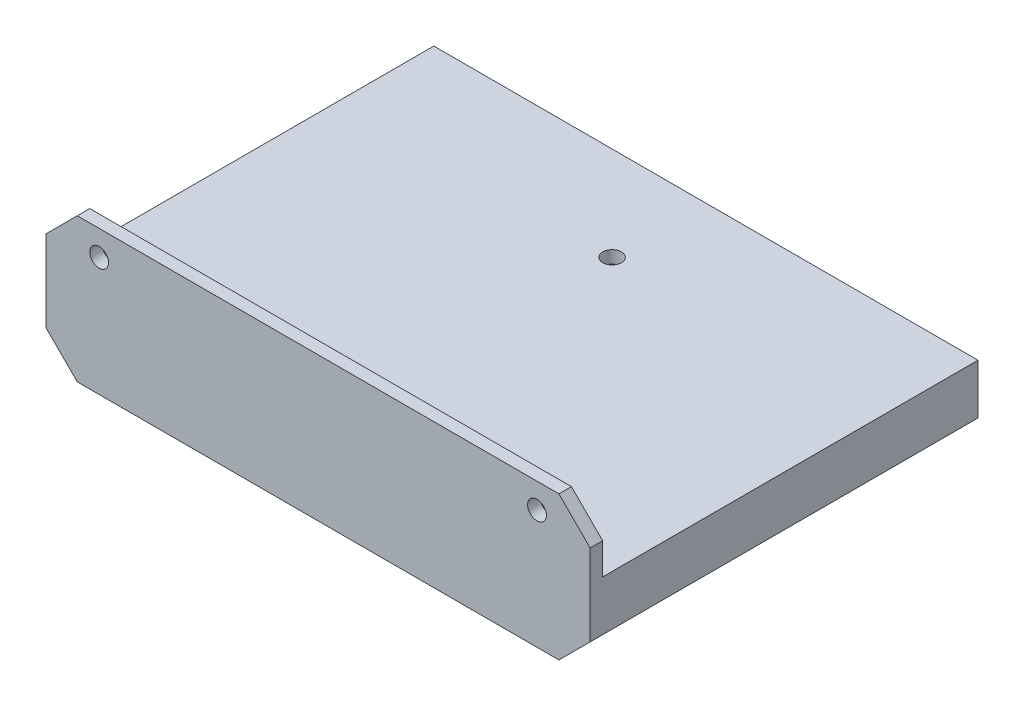
ISO-10303-21;
HEADER;
FILE_DESCRIPTION(('STEP AP214'),'2;1');
FILE_NAME('part.step','',(''),(''),'','','');
FILE_SCHEMA(('AUTOMOTIVE_DESIGN { 1 0 10303 214 1 1 1 1 }'));
ENDSEC;
DATA;
#1=APPLICATION_CONTEXT('core data for automotive mechanical design processes');
#2=APPLICATION_PROTOCOL_DEFINITION('international standard','automotive_design',2000,#1);
#3=PRODUCT_CONTEXT('',#1,'mechanical');
#4=PRODUCT('Part','Part','',(#3));
#5=PRODUCT_RELATED_PRODUCT_CATEGORY('part','',(#4));
#6=PRODUCT_DEFINITION_FORMATION('','',#4);
#7=PRODUCT_DEFINITION_CONTEXT('part definition',#1,'design');
#8=PRODUCT_DEFINITION('design','',#6,#7);
#9=PRODUCT_DEFINITION_SHAPE('','',#8);
#10=(LENGTH_UNIT() NAMED_UNIT(*) SI_UNIT(.MILLI.,.METRE.));
#11=(NAMED_UNIT(*) PLANE_ANGLE_UNIT() SI_UNIT($,.RADIAN.));
#12=(NAMED_UNIT(*) SI_UNIT($,.STERADIAN.) SOLID_ANGLE_UNIT());
#13=UNCERTAINTY_MEASURE_WITH_UNIT(LENGTH_MEASURE(1.E-05),#10,'distance_accuracy_value','');
#14=(GEOMETRIC_REPRESENTATION_CONTEXT(3) GLOBAL_UNCERTAINTY_ASSIGNED_CONTEXT((#13)) GLOBAL_UNIT_ASSIGNED_CONTEXT((#10,
#11,#12)) REPRESENTATION_CONTEXT('',''));
#15=CARTESIAN_POINT('',(0.,0.,0.));
#16=DIRECTION('',(0.,0.,1.));
#17=DIRECTION('',(1.,0.,0.));
#18=AXIS2_PLACEMENT_3D('',#15,#16,#17);
#19=CARTESIAN_POINT('',(0.,17.2426406871193,15.));
#20=DIRECTION('',(0.,-1.,0.));
#21=DIRECTION('',(1.,0.,0.));
#22=AXIS2_PLACEMENT_3D('',#19,#20,#21);
#23=CYLINDRICAL_SURFACE('',#22,1.5);
#24=CARTESIAN_POINT('',(0.,13.,15.));
#25=DIRECTION('',(0.,-1.,0.));
#26=DIRECTION('',(0.,0.,-1.));
#27=AXIS2_PLACEMENT_3D('',#24,#25,#26);
#28=CIRCLE('',#27,1.5);
#29=CARTESIAN_POINT('',(0.,13.,13.5));
#30=VERTEX_POINT('',#29);
#31=EDGE_CURVE('E216',#30,#30,#28,.F.);
#32=ORIENTED_EDGE('',*,*,#31,.T.);
#33=EDGE_LOOP('',(#32));
#34=FACE_BOUND('',#33,.T.);
#35=CARTESIAN_POINT('',(0.,11.,15.));
#36=DIRECTION('',(0.,-1.,0.));
#37=DIRECTION('',(1.,0.,0.));
#38=AXIS2_PLACEMENT_3D('',#35,#36,#37);
#39=CIRCLE('',#38,1.5);
#40=CARTESIAN_POINT('',(1.50000000000001,11.,15.));
#41=VERTEX_POINT('',#40);
#42=EDGE_CURVE('E213',#41,#41,#39,.F.);
#43=ORIENTED_EDGE('',*,*,#42,.F.);
#44=EDGE_LOOP('',(#43));
#45=FACE_BOUND('',#44,.T.);
#46=ADVANCED_FACE('F39',(#34,#45),#23,.F.);
#47=CARTESIAN_POINT('',(-43.5000000000001,13.,60.));
#48=DIRECTION('',(1.,0.,0.));
#49=DIRECTION('',(0.,0.,-1.));
#50=AXIS2_PLACEMENT_3D('',#47,#48,#49);
#51=PLANE('',#50);
#52=DIRECTION('',(0.,-1.,0.));
#53=VECTOR('',#52,1.);
#54=CARTESIAN_POINT('',(-43.5000000000001,13.,0.));
#55=LINE('',#54,#53);
#56=CARTESIAN_POINT('',(-43.5000000000001,13.,0.));
#57=VERTEX_POINT('',#56);
#58=CARTESIAN_POINT('',(-43.5000000000001,5.00000000000002,0.));
#59=VERTEX_POINT('',#58);
#60=EDGE_CURVE('E187',#57,#59,#55,.T.);
#61=ORIENTED_EDGE('',*,*,#60,.T.);
#62=DIRECTION('',(0.,0.,1.));
#63=VECTOR('',#62,1.);
#64=CARTESIAN_POINT('',(-43.5000000000001,5.00000000000002,60.));
#65=LINE('',#64,#63);
#66=CARTESIAN_POINT('',(-43.5000000000001,5.00000000000002,62.));
#67=VERTEX_POINT('',#66);
#68=EDGE_CURVE('E265',#59,#67,#65,.T.);
#69=ORIENTED_EDGE('',*,*,#68,.T.);
#70=DIRECTION('',(0.,-1.,0.));
#71=VECTOR('',#70,1.);
#72=CARTESIAN_POINT('',(-43.5000000000001,0.,62.));
#73=LINE('',#72,#71);
#74=CARTESIAN_POINT('',(-43.5000000000001,18.,62.));
#75=VERTEX_POINT('',#74);
#76=EDGE_CURVE('E275',#75,#67,#73,.T.);
#77=ORIENTED_EDGE('',*,*,#76,.F.);
#78=DIRECTION('',(0.,0.,-1.));
#79=VECTOR('',#78,1.);
#80=CARTESIAN_POINT('',(-43.5000000000001,18.,60.));
#81=LINE('',#80,#79);
#82=CARTESIAN_POINT('',(-43.5000000000001,18.,60.));
#83=VERTEX_POINT('',#82);
#84=EDGE_CURVE('E162',#75,#83,#81,.T.);
#85=ORIENTED_EDGE('',*,*,#84,.T.);
#86=DIRECTION('',(0.,-1.,0.));
#87=VECTOR('',#86,1.);
#88=CARTESIAN_POINT('',(-43.5000000000001,0.,60.));
#89=LINE('',#88,#87);
#90=CARTESIAN_POINT('',(-43.5000000000001,13.,60.));
#91=VERTEX_POINT('',#90);
#92=EDGE_CURVE('E154',#83,#91,#89,.T.);
#93=ORIENTED_EDGE('',*,*,#92,.T.);
#94=DIRECTION('',(0.,0.,-1.));
#95=VECTOR('',#94,1.);
#96=CARTESIAN_POINT('',(-43.5000000000001,13.,60.));
#97=LINE('',#96,#95);
#98=EDGE_CURVE('E158',#91,#57,#97,.T.);
#99=ORIENTED_EDGE('',*,*,#98,.T.);
#100=EDGE_LOOP('',(#61,#69,#77,#85,#93,#99));
#101=FACE_BOUND('',#100,.T.);
#102=ADVANCED_FACE('F157',(#101),#51,.F.);
#103=CARTESIAN_POINT('',(-38.5000000000001,7.99999999999999,60.));
#104=DIRECTION('',(-0.707106781186544,-0.707106781186552,0.));
#105=DIRECTION('',(0.707106781186552,-0.707106781186544,0.));
#106=AXIS2_PLACEMENT_3D('',#103,#104,#105);
#107=PLANE('',#106);
#108=DIRECTION('',(0.,0.,-1.));
#109=VECTOR('',#108,1.);
#110=CARTESIAN_POINT('',(-30.5,0.,60.));
#111=LINE('',#110,#109);
#112=CARTESIAN_POINT('',(-30.5,0.,60.));
#113=VERTEX_POINT('',#112);
#114=CARTESIAN_POINT('',(-30.5,0.,1.));
#115=VERTEX_POINT('',#114);
#116=EDGE_CURVE('E209',#113,#115,#111,.T.);
#117=ORIENTED_EDGE('',*,*,#116,.T.);
#118=DIRECTION('',(-0.707106781186552,0.707106781186544,0.));
#119=VECTOR('',#118,1.);
#120=CARTESIAN_POINT('',(-38.5000000000001,7.99999999999999,1.));
#121=LINE('',#120,#119);
#122=CARTESIAN_POINT('',(-38.5000000000001,7.99999999999999,1.));
#123=VERTEX_POINT('',#122);
#124=EDGE_CURVE('E233',#115,#123,#121,.T.);
#125=ORIENTED_EDGE('',*,*,#124,.T.);
#126=DIRECTION('',(0.,0.,-1.));
#127=VECTOR('',#126,1.);
#128=CARTESIAN_POINT('',(-38.5000000000001,7.99999999999999,60.));
#129=LINE('',#128,#127);
#130=CARTESIAN_POINT('',(-38.5000000000001,7.99999999999999,60.));
#131=VERTEX_POINT('',#130);
#132=EDGE_CURVE('E206',#131,#123,#129,.T.);
#133=ORIENTED_EDGE('',*,*,#132,.F.);
#134=DIRECTION('',(-0.707106781186552,0.707106781186544,0.));
#135=VECTOR('',#134,1.);
#136=CARTESIAN_POINT('',(-38.5000000000001,7.99999999999999,60.));
#137=LINE('',#136,#135);
#138=EDGE_CURVE('E197',#113,#131,#137,.T.);
#139=ORIENTED_EDGE('',*,*,#138,.F.);
#140=EDGE_LOOP('',(#117,#125,#133,#139));
#141=FACE_BOUND('',#140,.T.);
#142=ADVANCED_FACE('F339',(#141),#107,.F.);
#143=CARTESIAN_POINT('',(38.5000000000001,7.99999999999999,60.));
#144=DIRECTION('',(0.,1.,0.));
#145=DIRECTION('',(-1.,0.,0.));
#146=AXIS2_PLACEMENT_3D('',#143,#144,#145);
#147=PLANE('',#146);
#148=CARTESIAN_POINT('',(0.,7.99999999999999,15.));
#149=DIRECTION('',(0.,-1.,0.));
#150=DIRECTION('',(1.,0.,0.));
#151=AXIS2_PLACEMENT_3D('',#148,#149,#150);
#152=CIRCLE('',#151,4.);
#153=CARTESIAN_POINT('',(4.00000000000001,7.99999999999999,15.));
#154=VERTEX_POINT('',#153);
#155=EDGE_CURVE('E242',#154,#154,#152,.T.);
#156=ORIENTED_EDGE('',*,*,#155,.F.);
#157=EDGE_LOOP('',(#156));
#158=FACE_BOUND('',#157,.T.);
#159=ORIENTED_EDGE('',*,*,#132,.T.);
#160=DIRECTION('',(1.,0.,0.));
#161=VECTOR('',#160,1.);
#162=CARTESIAN_POINT('',(38.5000000000001,7.99999999999999,1.));
#163=LINE('',#162,#161);
#164=CARTESIAN_POINT('',(38.5000000000001,7.99999999999999,1.));
#165=VERTEX_POINT('',#164);
#166=EDGE_CURVE('E231',#123,#165,#163,.T.);
#167=ORIENTED_EDGE('',*,*,#166,.T.);
#168=DIRECTION('',(0.,0.,-1.));
#169=VECTOR('',#168,1.);
#170=CARTESIAN_POINT('',(38.5000000000001,7.99999999999999,60.));
#171=LINE('',#170,#169);
#172=CARTESIAN_POINT('',(38.5000000000001,7.99999999999999,60.));
#173=VERTEX_POINT('',#172);
#174=EDGE_CURVE('E203',#173,#165,#171,.T.);
#175=ORIENTED_EDGE('',*,*,#174,.F.);
#176=DIRECTION('',(1.,0.,0.));
#177=VECTOR('',#176,1.);
#178=CARTESIAN_POINT('',(38.5000000000001,7.99999999999999,60.));
#179=LINE('',#178,#177);
#180=EDGE_CURVE('E183',#131,#173,#179,.T.);
#181=ORIENTED_EDGE('',*,*,#180,.F.);
#182=EDGE_LOOP('',(#159,#167,#175,#181));
#183=FACE_BOUND('',#182,.T.);
#184=ADVANCED_FACE('F293',(#158,#183),#147,.F.);
#185=CARTESIAN_POINT('',(30.5,0.,60.));
#186=DIRECTION('',(0.707106781186544,-0.707106781186551,0.));
#187=DIRECTION('',(0.707106781186551,0.707106781186544,0.));
#188=AXIS2_PLACEMENT_3D('',#185,#186,#187);
#189=PLANE('',#188);
#190=ORIENTED_EDGE('',*,*,#174,.T.);
#191=DIRECTION('',(-0.707106781186551,-0.707106781186544,0.));
#192=VECTOR('',#191,1.);
#193=CARTESIAN_POINT('',(30.5,0.,1.));
#194=LINE('',#193,#192);
#195=CARTESIAN_POINT('',(30.5,0.,1.));
#196=VERTEX_POINT('',#195);
#197=EDGE_CURVE('E212',#165,#196,#194,.T.);
#198=ORIENTED_EDGE('',*,*,#197,.T.);
#199=DIRECTION('',(0.,0.,-1.));
#200=VECTOR('',#199,1.);
#201=CARTESIAN_POINT('',(30.5,0.,60.));
#202=LINE('',#201,#200);
#203=CARTESIAN_POINT('',(30.5,0.,60.));
#204=VERTEX_POINT('',#203);
#205=EDGE_CURVE('E200',#204,#196,#202,.T.);
#206=ORIENTED_EDGE('',*,*,#205,.F.);
#207=DIRECTION('',(-0.707106781186551,-0.707106781186544,0.));
#208=VECTOR('',#207,1.);
#209=CARTESIAN_POINT('',(30.5,0.,60.));
#210=LINE('',#209,#208);
#211=EDGE_CURVE('E180',#173,#204,#210,.T.);
#212=ORIENTED_EDGE('',*,*,#211,.F.);
#213=EDGE_LOOP('',(#190,#198,#206,#212));
#214=FACE_BOUND('',#213,.T.);
#215=ADVANCED_FACE('F298',(#214),#189,.F.);
#216=CARTESIAN_POINT('',(30.5,0.,60.));
#217=DIRECTION('',(0.,1.,0.));
#218=DIRECTION('',(-1.,0.,0.));
#219=AXIS2_PLACEMENT_3D('',#216,#217,#218);
#220=PLANE('',#219);
#221=DIRECTION('',(1.,0.,0.));
#222=VECTOR('',#221,1.);
#223=CARTESIAN_POINT('',(30.5,0.,0.));
#224=LINE('',#223,#222);
#225=CARTESIAN_POINT('',(31.9142135623731,0.,0.));
#226=VERTEX_POINT('',#225);
#227=CARTESIAN_POINT('',(38.5000000000001,0.,0.));
#228=VERTEX_POINT('',#227);
#229=EDGE_CURVE('E192',#226,#228,#224,.T.);
#230=ORIENTED_EDGE('',*,*,#229,.T.);
#231=DIRECTION('',(0.,0.,1.));
#232=VECTOR('',#231,1.);
#233=CARTESIAN_POINT('',(38.5000000000001,0.,60.));
#234=LINE('',#233,#232);
#235=CARTESIAN_POINT('',(38.5,0.,62.));
#236=VERTEX_POINT('',#235);
#237=EDGE_CURVE('E254',#228,#236,#234,.T.);
#238=ORIENTED_EDGE('',*,*,#237,.T.);
#239=DIRECTION('',(1.,0.,0.));
#240=VECTOR('',#239,1.);
#241=CARTESIAN_POINT('',(-43.5000000000001,0.,62.));
#242=LINE('',#241,#240);
#243=CARTESIAN_POINT('',(-38.5000000000001,0.,62.));
#244=VERTEX_POINT('',#243);
#245=EDGE_CURVE('E278',#244,#236,#242,.T.);
#246=ORIENTED_EDGE('',*,*,#245,.F.);
#247=DIRECTION('',(0.,0.,-1.));
#248=VECTOR('',#247,1.);
#249=CARTESIAN_POINT('',(-38.5000000000001,0.,60.));
#250=LINE('',#249,#248);
#251=CARTESIAN_POINT('',(-38.5000000000001,0.,0.));
#252=VERTEX_POINT('',#251);
#253=EDGE_CURVE('E251',#244,#252,#250,.T.);
#254=ORIENTED_EDGE('',*,*,#253,.T.);
#255=DIRECTION('',(1.,0.,0.));
#256=VECTOR('',#255,1.);
#257=CARTESIAN_POINT('',(-43.5000000000001,0.,0.));
#258=LINE('',#257,#256);
#259=CARTESIAN_POINT('',(-31.9142135623731,0.,0.));
#260=VERTEX_POINT('',#259);
#261=EDGE_CURVE('E189',#252,#260,#258,.T.);
#262=ORIENTED_EDGE('',*,*,#261,.T.);
#263=DIRECTION('',(-0.816496580927728,0.,-0.577350269189624));
#264=VECTOR('',#263,1.);
#265=CARTESIAN_POINT('',(-35.8333333333334,0.,-2.77123616632828));
#266=LINE('',#265,#264);
#267=EDGE_CURVE('E220',#260,#115,#266,.F.);
#268=ORIENTED_EDGE('',*,*,#267,.T.);
#269=ORIENTED_EDGE('',*,*,#116,.F.);
#270=DIRECTION('',(1.,0.,0.));
#271=VECTOR('',#270,1.);
#272=CARTESIAN_POINT('',(-43.5000000000001,0.,60.));
#273=LINE('',#272,#271);
#274=EDGE_CURVE('E164',#113,#204,#273,.T.);
#275=ORIENTED_EDGE('',*,*,#274,.T.);
#276=ORIENTED_EDGE('',*,*,#205,.T.);
#277=DIRECTION('',(-0.816496580927727,0.,0.577350269189624));
#278=VECTOR('',#277,1.);
#279=CARTESIAN_POINT('',(30.5,0.,1.));
#280=LINE('',#279,#278);
#281=EDGE_CURVE('E222',#196,#226,#280,.F.);
#282=ORIENTED_EDGE('',*,*,#281,.T.);
#283=EDGE_LOOP('',(#230,#238,#246,#254,#262,#268,#269,#275,#276,#282));
#284=FACE_BOUND('',#283,.T.);
#285=ADVANCED_FACE('F301',(#284),#220,.F.);
#286=CARTESIAN_POINT('',(43.5000000000001,13.,60.));
#287=DIRECTION('',(-1.,0.,0.));
#288=DIRECTION('',(0.,-1.,0.));
#289=AXIS2_PLACEMENT_3D('',#286,#287,#288);
#290=PLANE('',#289);
#291=DIRECTION('',(0.,1.,0.));
#292=VECTOR('',#291,1.);
#293=CARTESIAN_POINT('',(43.5000000000001,0.,62.));
#294=LINE('',#293,#292);
#295=CARTESIAN_POINT('',(43.5000000000001,4.99999999999999,62.));
#296=VERTEX_POINT('',#295);
#297=CARTESIAN_POINT('',(43.5000000000001,18.,62.));
#298=VERTEX_POINT('',#297);
#299=EDGE_CURVE('E305',#296,#298,#294,.T.);
#300=ORIENTED_EDGE('',*,*,#299,.F.);
#301=DIRECTION('',(0.,0.,-1.));
#302=VECTOR('',#301,1.);
#303=CARTESIAN_POINT('',(43.5000000000001,4.99999999999999,60.));
#304=LINE('',#303,#302);
#305=CARTESIAN_POINT('',(43.5000000000001,4.99999999999999,0.));
#306=VERTEX_POINT('',#305);
#307=EDGE_CURVE('E244',#296,#306,#304,.T.);
#308=ORIENTED_EDGE('',*,*,#307,.T.);
#309=DIRECTION('',(0.,1.,0.));
#310=VECTOR('',#309,1.);
#311=CARTESIAN_POINT('',(43.5000000000001,13.,0.));
#312=LINE('',#311,#310);
#313=CARTESIAN_POINT('',(43.5000000000001,13.,0.));
#314=VERTEX_POINT('',#313);
#315=EDGE_CURVE('E195',#306,#314,#312,.T.);
#316=ORIENTED_EDGE('',*,*,#315,.T.);
#317=DIRECTION('',(0.,0.,-1.));
#318=VECTOR('',#317,1.);
#319=CARTESIAN_POINT('',(43.5000000000001,13.,60.));
#320=LINE('',#319,#318);
#321=CARTESIAN_POINT('',(43.5000000000001,13.,60.));
#322=VERTEX_POINT('',#321);
#323=EDGE_CURVE('E175',#322,#314,#320,.T.);
#324=ORIENTED_EDGE('',*,*,#323,.F.);
#325=DIRECTION('',(0.,1.,0.));
#326=VECTOR('',#325,1.);
#327=CARTESIAN_POINT('',(43.5000000000001,0.,60.));
#328=LINE('',#327,#326);
#329=CARTESIAN_POINT('',(43.5000000000001,18.,60.));
#330=VERTEX_POINT('',#329);
#331=EDGE_CURVE('E179',#322,#330,#328,.T.);
#332=ORIENTED_EDGE('',*,*,#331,.T.);
#333=DIRECTION('',(0.,0.,1.));
#334=VECTOR('',#333,1.);
#335=CARTESIAN_POINT('',(43.5000000000001,18.,60.));
#336=LINE('',#335,#334);
#337=EDGE_CURVE('E235',#330,#298,#336,.T.);
#338=ORIENTED_EDGE('',*,*,#337,.T.);
#339=EDGE_LOOP('',(#300,#308,#316,#324,#332,#338));
#340=FACE_BOUND('',#339,.T.);
#341=ADVANCED_FACE('F381',(#340),#290,.F.);
#342=CARTESIAN_POINT('',(-43.5000000000001,13.,60.));
#343=DIRECTION('',(0.,-1.,0.));
#344=DIRECTION('',(0.,0.,-1.));
#345=AXIS2_PLACEMENT_3D('',#342,#343,#344);
#346=PLANE('',#345);
#347=ORIENTED_EDGE('',*,*,#31,.F.);
#348=EDGE_LOOP('',(#347));
#349=FACE_BOUND('',#348,.T.);
#350=DIRECTION('',(-1.,0.,0.));
#351=VECTOR('',#350,1.);
#352=CARTESIAN_POINT('',(-43.5000000000001,13.,0.));
#353=LINE('',#352,#351);
#354=EDGE_CURVE('E174',#314,#57,#353,.T.);
#355=ORIENTED_EDGE('',*,*,#354,.T.);
#356=ORIENTED_EDGE('',*,*,#98,.F.);
#357=DIRECTION('',(-1.,0.,0.));
#358=VECTOR('',#357,1.);
#359=CARTESIAN_POINT('',(-43.5000000000001,13.,60.));
#360=LINE('',#359,#358);
#361=EDGE_CURVE('E171',#322,#91,#360,.T.);
#362=ORIENTED_EDGE('',*,*,#361,.F.);
#363=ORIENTED_EDGE('',*,*,#323,.T.);
#364=EDGE_LOOP('',(#355,#356,#362,#363));
#365=FACE_BOUND('',#364,.T.);
#366=ADVANCED_FACE('F169',(#349,#365),#346,.F.);
#367=CARTESIAN_POINT('',(0.,0.,0.));
#368=DIRECTION('',(0.,0.,1.));
#369=DIRECTION('',(1.,0.,0.));
#370=AXIS2_PLACEMENT_3D('',#367,#368,#369);
#371=PLANE('',#370);
#372=ORIENTED_EDGE('',*,*,#315,.F.);
#373=DIRECTION('',(0.70710678118655,0.707106781186546,0.));
#374=VECTOR('',#373,1.);
#375=CARTESIAN_POINT('',(43.5000000000001,4.99999999999999,0.));
#376=LINE('',#375,#374);
#377=EDGE_CURVE('E249',#306,#228,#376,.F.);
#378=ORIENTED_EDGE('',*,*,#377,.T.);
#379=ORIENTED_EDGE('',*,*,#229,.F.);
#380=DIRECTION('',(0.707106781186551,0.707106781186544,0.));
#381=VECTOR('',#380,1.);
#382=CARTESIAN_POINT('',(15.9571067811864,-15.9571067811866,0.));
#383=LINE('',#382,#381);
#384=CARTESIAN_POINT('',(40.9142135623732,9.,0.));
#385=VERTEX_POINT('',#384);
#386=EDGE_CURVE('E229',#226,#385,#383,.T.);
#387=ORIENTED_EDGE('',*,*,#386,.T.);
#388=DIRECTION('',(-1.,0.,0.));
#389=VECTOR('',#388,1.);
#390=CARTESIAN_POINT('',(0.,8.99999999999999,0.));
#391=LINE('',#390,#389);
#392=CARTESIAN_POINT('',(-40.9142135623732,8.99999999999999,0.));
#393=VERTEX_POINT('',#392);
#394=EDGE_CURVE('E227',#385,#393,#391,.T.);
#395=ORIENTED_EDGE('',*,*,#394,.T.);
#396=DIRECTION('',(0.707106781186552,-0.707106781186544,0.));
#397=VECTOR('',#396,1.);
#398=CARTESIAN_POINT('',(-15.9571067811864,-15.9571067811866,0.));
#399=LINE('',#398,#397);
#400=EDGE_CURVE('E224',#393,#260,#399,.T.);
#401=ORIENTED_EDGE('',*,*,#400,.T.);
#402=ORIENTED_EDGE('',*,*,#261,.F.);
#403=DIRECTION('',(0.707106781186545,-0.70710678118655,0.));
#404=VECTOR('',#403,1.);
#405=CARTESIAN_POINT('',(-38.5000000000001,0.,0.));
#406=LINE('',#405,#404);
#407=EDGE_CURVE('E247',#252,#59,#406,.F.);
#408=ORIENTED_EDGE('',*,*,#407,.T.);
#409=ORIENTED_EDGE('',*,*,#60,.F.);
#410=ORIENTED_EDGE('',*,*,#354,.F.);
#411=EDGE_LOOP('',(#372,#378,#379,#387,#395,#401,#402,#408,#409,#410));
#412=FACE_BOUND('',#411,.T.);
#413=ADVANCED_FACE('F375',(#412),#371,.F.);
#414=CARTESIAN_POINT('',(0.,0.,60.));
#415=DIRECTION('',(0.,0.,-1.));
#416=DIRECTION('',(-1.,0.,0.));
#417=AXIS2_PLACEMENT_3D('',#414,#415,#416);
#418=PLANE('',#417);
#419=ORIENTED_EDGE('',*,*,#274,.F.);
#420=ORIENTED_EDGE('',*,*,#138,.T.);
#421=ORIENTED_EDGE('',*,*,#180,.T.);
#422=ORIENTED_EDGE('',*,*,#211,.T.);
#423=EDGE_LOOP('',(#419,#420,#421,#422));
#424=FACE_BOUND('',#423,.T.);
#425=ADVANCED_FACE('F288',(#424),#418,.T.);
#426=CARTESIAN_POINT('',(-43.5000000000001,23.,62.));
#427=DIRECTION('',(0.,-1.,0.));
#428=DIRECTION('',(0.,0.,-1.));
#429=AXIS2_PLACEMENT_3D('',#426,#427,#428);
#430=PLANE('',#429);
#431=DIRECTION('',(-1.,0.,0.));
#432=VECTOR('',#431,1.);
#433=CARTESIAN_POINT('',(-43.5000000000001,23.,60.));
#434=LINE('',#433,#432);
#435=CARTESIAN_POINT('',(38.5000000000001,23.,60.));
#436=VERTEX_POINT('',#435);
#437=CARTESIAN_POINT('',(-38.5000000000001,23.,60.));
#438=VERTEX_POINT('',#437);
#439=EDGE_CURVE('E271',#436,#438,#434,.T.);
#440=ORIENTED_EDGE('',*,*,#439,.T.);
#441=DIRECTION('',(0.,0.,1.));
#442=VECTOR('',#441,1.);
#443=CARTESIAN_POINT('',(-38.5000000000001,23.,62.));
#444=LINE('',#443,#442);
#445=CARTESIAN_POINT('',(-38.5000000000001,23.,62.));
#446=VERTEX_POINT('',#445);
#447=EDGE_CURVE('E11',#438,#446,#444,.T.);
#448=ORIENTED_EDGE('',*,*,#447,.T.);
#449=DIRECTION('',(-1.,0.,0.));
#450=VECTOR('',#449,1.);
#451=CARTESIAN_POINT('',(-43.5000000000001,23.,62.));
#452=LINE('',#451,#450);
#453=CARTESIAN_POINT('',(38.5000000000001,23.,62.));
#454=VERTEX_POINT('',#453);
#455=EDGE_CURVE('E190',#454,#446,#452,.T.);
#456=ORIENTED_EDGE('',*,*,#455,.F.);
#457=DIRECTION('',(0.,0.,-1.));
#458=VECTOR('',#457,1.);
#459=CARTESIAN_POINT('',(38.5000000000001,23.,62.));
#460=LINE('',#459,#458);
#461=EDGE_CURVE('E48',#454,#436,#460,.T.);
#462=ORIENTED_EDGE('',*,*,#461,.T.);
#463=EDGE_LOOP('',(#440,#448,#456,#462));
#464=FACE_BOUND('',#463,.T.);
#465=ADVANCED_FACE('F270',(#464),#430,.F.);
#466=CARTESIAN_POINT('',(0.,0.,62.));
#467=DIRECTION('',(0.,0.,-1.));
#468=DIRECTION('',(-1.,0.,0.));
#469=AXIS2_PLACEMENT_3D('',#466,#467,#468);
#470=PLANE('',#469);
#471=CARTESIAN_POINT('',(-35.,19.,62.));
#472=DIRECTION('',(0.,0.,1.));
#473=DIRECTION('',(1.,0.,0.));
#474=AXIS2_PLACEMENT_3D('',#471,#472,#473);
#475=CIRCLE('',#474,1.5);
#476=CARTESIAN_POINT('',(-33.5,19.,62.));
#477=VERTEX_POINT('',#476);
#478=EDGE_CURVE('E313',#477,#477,#475,.T.);
#479=ORIENTED_EDGE('',*,*,#478,.F.);
#480=EDGE_LOOP('',(#479));
#481=FACE_BOUND('',#480,.T.);
#482=CARTESIAN_POINT('',(35.,19.,62.));
#483=DIRECTION('',(0.,0.,1.));
#484=DIRECTION('',(-1.,0.,0.));
#485=AXIS2_PLACEMENT_3D('',#482,#483,#484);
#486=CIRCLE('',#485,1.50000000000001);
#487=CARTESIAN_POINT('',(33.5,19.,62.));
#488=VERTEX_POINT('',#487);
#489=EDGE_CURVE('E314',#488,#488,#486,.T.);
#490=ORIENTED_EDGE('',*,*,#489,.F.);
#491=EDGE_LOOP('',(#490));
#492=FACE_BOUND('',#491,.T.);
#493=ORIENTED_EDGE('',*,*,#245,.T.);
#494=DIRECTION('',(-0.70710678118655,-0.707106781186546,0.));
#495=VECTOR('',#494,1.);
#496=CARTESIAN_POINT('',(43.5000000000001,4.99999999999999,62.));
#497=LINE('',#496,#495);
#498=EDGE_CURVE('E262',#236,#296,#497,.F.);
#499=ORIENTED_EDGE('',*,*,#498,.T.);
#500=ORIENTED_EDGE('',*,*,#299,.T.);
#501=DIRECTION('',(0.707106781186545,-0.70710678118655,0.));
#502=VECTOR('',#501,1.);
#503=CARTESIAN_POINT('',(38.5000000000001,23.,62.));
#504=LINE('',#503,#502);
#505=EDGE_CURVE('E256',#298,#454,#504,.F.);
#506=ORIENTED_EDGE('',*,*,#505,.T.);
#507=ORIENTED_EDGE('',*,*,#455,.T.);
#508=DIRECTION('',(0.707106781186549,0.707106781186547,0.));
#509=VECTOR('',#508,1.);
#510=CARTESIAN_POINT('',(-43.5000000000001,18.,62.));
#511=LINE('',#510,#509);
#512=EDGE_CURVE('E258',#446,#75,#511,.F.);
#513=ORIENTED_EDGE('',*,*,#512,.T.);
#514=ORIENTED_EDGE('',*,*,#76,.T.);
#515=DIRECTION('',(-0.707106781186545,0.70710678118655,0.));
#516=VECTOR('',#515,1.);
#517=CARTESIAN_POINT('',(-38.5000000000001,0.,62.));
#518=LINE('',#517,#516);
#519=EDGE_CURVE('E260',#67,#244,#518,.F.);
#520=ORIENTED_EDGE('',*,*,#519,.T.);
#521=EDGE_LOOP('',(#493,#499,#500,#506,#507,#513,#514,#520));
#522=FACE_BOUND('',#521,.T.);
#523=ADVANCED_FACE('F366',(#481,#492,#522),#470,.F.);
#524=CARTESIAN_POINT('',(-35.,19.,60.));
#525=DIRECTION('',(0.,0.,-1.));
#526=DIRECTION('',(-1.,0.,0.));
#527=AXIS2_PLACEMENT_3D('',#524,#525,#526);
#528=CIRCLE('',#527,1.5);
#529=CARTESIAN_POINT('',(-36.5,19.,60.));
#530=VERTEX_POINT('',#529);
#531=EDGE_CURVE('E165',#530,#530,#528,.F.);
#532=ORIENTED_EDGE('',*,*,#531,.T.);
#533=EDGE_LOOP('',(#532));
#534=FACE_BOUND('',#533,.T.);
#535=CARTESIAN_POINT('',(35.,19.,60.));
#536=DIRECTION('',(0.,0.,-1.));
#537=DIRECTION('',(-1.,0.,0.));
#538=AXIS2_PLACEMENT_3D('',#535,#536,#537);
#539=CIRCLE('',#538,1.50000000000001);
#540=CARTESIAN_POINT('',(33.5,19.,60.));
#541=VERTEX_POINT('',#540);
#542=EDGE_CURVE('E310',#541,#541,#539,.F.);
#543=ORIENTED_EDGE('',*,*,#542,.T.);
#544=EDGE_LOOP('',(#543));
#545=FACE_BOUND('',#544,.T.);
#546=ORIENTED_EDGE('',*,*,#92,.F.);
#547=DIRECTION('',(-0.707106781186549,-0.707106781186547,0.));
#548=VECTOR('',#547,1.);
#549=CARTESIAN_POINT('',(-30.75,30.7500000000001,60.));
#550=LINE('',#549,#548);
#551=EDGE_CURVE('E55',#83,#438,#550,.F.);
#552=ORIENTED_EDGE('',*,*,#551,.T.);
#553=ORIENTED_EDGE('',*,*,#439,.F.);
#554=DIRECTION('',(-0.707106781186545,0.70710678118655,0.));
#555=VECTOR('',#554,1.);
#556=CARTESIAN_POINT('',(30.7500000000002,30.75,60.));
#557=LINE('',#556,#555);
#558=EDGE_CURVE('E63',#436,#330,#557,.F.);
#559=ORIENTED_EDGE('',*,*,#558,.T.);
#560=ORIENTED_EDGE('',*,*,#331,.F.);
#561=ORIENTED_EDGE('',*,*,#361,.T.);
#562=EDGE_LOOP('',(#546,#552,#553,#559,#560,#561));
#563=FACE_BOUND('',#562,.T.);
#564=ADVANCED_FACE('F177',(#534,#545,#563),#418,.T.);
#565=CARTESIAN_POINT('',(35.,19.,55.7573593128807));
#566=DIRECTION('',(0.,0.,1.));
#567=DIRECTION('',(1.,0.,0.));
#568=AXIS2_PLACEMENT_3D('',#565,#566,#567);
#569=CYLINDRICAL_SURFACE('',#568,1.50000000000001);
#570=ORIENTED_EDGE('',*,*,#489,.T.);
#571=EDGE_LOOP('',(#570));
#572=FACE_BOUND('',#571,.T.);
#573=ORIENTED_EDGE('',*,*,#542,.F.);
#574=EDGE_LOOP('',(#573));
#575=FACE_BOUND('',#574,.T.);
#576=ADVANCED_FACE('F361',(#572,#575),#569,.F.);
#577=CARTESIAN_POINT('',(-35.,19.,55.7573593128807));
#578=DIRECTION('',(0.,0.,1.));
#579=DIRECTION('',(1.,0.,0.));
#580=AXIS2_PLACEMENT_3D('',#577,#578,#579);
#581=CYLINDRICAL_SURFACE('',#580,1.5);
#582=ORIENTED_EDGE('',*,*,#478,.T.);
#583=EDGE_LOOP('',(#582));
#584=FACE_BOUND('',#583,.T.);
#585=ORIENTED_EDGE('',*,*,#531,.F.);
#586=EDGE_LOOP('',(#585));
#587=FACE_BOUND('',#586,.T.);
#588=ADVANCED_FACE('F358',(#584,#587),#581,.F.);
#589=CARTESIAN_POINT('',(0.,11.,15.));
#590=DIRECTION('',(0.,-1.,0.));
#591=DIRECTION('',(1.,0.,0.));
#592=AXIS2_PLACEMENT_3D('',#589,#590,#591);
#593=PLANE('',#592);
#594=CARTESIAN_POINT('',(0.,11.,15.));
#595=DIRECTION('',(0.,-1.,0.));
#596=DIRECTION('',(1.,0.,0.));
#597=AXIS2_PLACEMENT_3D('',#594,#595,#596);
#598=CIRCLE('',#597,4.);
#599=CARTESIAN_POINT('',(4.,11.,15.));
#600=VERTEX_POINT('',#599);
#601=EDGE_CURVE('E217',#600,#600,#598,.T.);
#602=ORIENTED_EDGE('',*,*,#601,.T.);
#603=EDGE_LOOP('',(#602));
#604=FACE_BOUND('',#603,.T.);
#605=ORIENTED_EDGE('',*,*,#42,.T.);
#606=EDGE_LOOP('',(#605));
#607=FACE_BOUND('',#606,.T.);
#608=ADVANCED_FACE('F328',(#604,#607),#593,.T.);
#609=CARTESIAN_POINT('',(0.,11.,15.));
#610=DIRECTION('',(0.,-1.,0.));
#611=DIRECTION('',(1.,0.,0.));
#612=AXIS2_PLACEMENT_3D('',#609,#610,#611);
#613=CYLINDRICAL_SURFACE('',#612,4.);
#614=ORIENTED_EDGE('',*,*,#601,.F.);
#615=EDGE_LOOP('',(#614));
#616=FACE_BOUND('',#615,.T.);
#617=ORIENTED_EDGE('',*,*,#155,.T.);
#618=EDGE_LOOP('',(#617));
#619=FACE_BOUND('',#618,.T.);
#620=ADVANCED_FACE('F331',(#616,#619),#613,.F.);
#621=CARTESIAN_POINT('',(-38.5000000000001,7.99999999999999,1.));
#622=DIRECTION('',(-0.499999999999997,-0.500000000000003,0.707106781186547));
#623=DIRECTION('',(-0.707106781186552,0.707106781186544,0.));
#624=AXIS2_PLACEMENT_3D('',#621,#622,#623);
#625=PLANE('',#624);
#626=ORIENTED_EDGE('',*,*,#267,.F.);
#627=ORIENTED_EDGE('',*,*,#400,.F.);
#628=DIRECTION('',(0.862856209461019,-0.357406744336591,0.357406744336591));
#629=VECTOR('',#628,1.);
#630=CARTESIAN_POINT('',(18.8281045418187,-15.7460784063638,24.7460784063638));
#631=LINE('',#630,#629);
#632=EDGE_CURVE('E239',#123,#393,#631,.F.);
#633=ORIENTED_EDGE('',*,*,#632,.F.);
#634=ORIENTED_EDGE('',*,*,#124,.F.);
#635=EDGE_LOOP('',(#626,#627,#633,#634));
#636=FACE_BOUND('',#635,.T.);
#637=ADVANCED_FACE('F334',(#636),#625,.F.);
#638=CARTESIAN_POINT('',(38.5000000000001,7.99999999999999,1.));
#639=DIRECTION('',(0.,0.707106781186547,0.707106781186547));
#640=DIRECTION('',(1.,0.,0.));
#641=AXIS2_PLACEMENT_3D('',#638,#639,#640);
#642=PLANE('',#641);
#643=ORIENTED_EDGE('',*,*,#632,.T.);
#644=ORIENTED_EDGE('',*,*,#394,.F.);
#645=DIRECTION('',(-0.862856209461018,-0.357406744336592,0.357406744336591));
#646=VECTOR('',#645,1.);
#647=CARTESIAN_POINT('',(30.0767082651239,4.51095832358912,4.48904167641087));
#648=LINE('',#647,#646);
#649=EDGE_CURVE('E236',#165,#385,#648,.F.);
#650=ORIENTED_EDGE('',*,*,#649,.F.);
#651=ORIENTED_EDGE('',*,*,#166,.F.);
#652=EDGE_LOOP('',(#643,#644,#650,#651));
#653=FACE_BOUND('',#652,.T.);
#654=ADVANCED_FACE('F446',(#653),#642,.F.);
#655=CARTESIAN_POINT('',(30.5,0.,1.));
#656=DIRECTION('',(0.499999999999998,-0.500000000000002,0.707106781186547));
#657=DIRECTION('',(-0.707106781186551,-0.707106781186544,0.));
#658=AXIS2_PLACEMENT_3D('',#655,#656,#657);
#659=PLANE('',#658);
#660=ORIENTED_EDGE('',*,*,#649,.T.);
#661=ORIENTED_EDGE('',*,*,#386,.F.);
#662=ORIENTED_EDGE('',*,*,#281,.F.);
#663=ORIENTED_EDGE('',*,*,#197,.F.);
#664=EDGE_LOOP('',(#660,#661,#662,#663));
#665=FACE_BOUND('',#664,.T.);
#666=ADVANCED_FACE('F454',(#665),#659,.F.);
#667=CARTESIAN_POINT('',(43.5000000000001,4.99999999999999,60.));
#668=DIRECTION('',(-0.707106781186545,0.707106781186549,0.));
#669=DIRECTION('',(0.,0.,-1.));
#670=AXIS2_PLACEMENT_3D('',#667,#668,#669);
#671=PLANE('',#670);
#672=ORIENTED_EDGE('',*,*,#498,.F.);
#673=ORIENTED_EDGE('',*,*,#237,.F.);
#674=ORIENTED_EDGE('',*,*,#377,.F.);
#675=ORIENTED_EDGE('',*,*,#307,.F.);
#676=EDGE_LOOP('',(#672,#673,#674,#675));
#677=FACE_BOUND('',#676,.T.);
#678=ADVANCED_FACE('F462',(#677),#671,.F.);
#679=CARTESIAN_POINT('',(-38.5000000000001,0.,60.));
#680=DIRECTION('',(0.70710678118655,0.707106781186545,0.));
#681=DIRECTION('',(0.,0.,-1.));
#682=AXIS2_PLACEMENT_3D('',#679,#680,#681);
#683=PLANE('',#682);
#684=ORIENTED_EDGE('',*,*,#519,.F.);
#685=ORIENTED_EDGE('',*,*,#68,.F.);
#686=ORIENTED_EDGE('',*,*,#407,.F.);
#687=ORIENTED_EDGE('',*,*,#253,.F.);
#688=EDGE_LOOP('',(#684,#685,#686,#687));
#689=FACE_BOUND('',#688,.T.);
#690=ADVANCED_FACE('F469',(#689),#683,.F.);
#691=CARTESIAN_POINT('',(-43.5000000000001,18.,60.));
#692=DIRECTION('',(0.707106781186547,-0.707106781186549,0.));
#693=DIRECTION('',(0.,0.,-1.));
#694=AXIS2_PLACEMENT_3D('',#691,#692,#693);
#695=PLANE('',#694);
#696=ORIENTED_EDGE('',*,*,#512,.F.);
#697=ORIENTED_EDGE('',*,*,#447,.F.);
#698=ORIENTED_EDGE('',*,*,#551,.F.);
#699=ORIENTED_EDGE('',*,*,#84,.F.);
#700=EDGE_LOOP('',(#696,#697,#698,#699));
#701=FACE_BOUND('',#700,.T.);
#702=ADVANCED_FACE('F477',(#701),#695,.F.);
#703=CARTESIAN_POINT('',(38.5000000000001,23.,62.));
#704=DIRECTION('',(-0.70710678118655,-0.707106781186545,0.));
#705=DIRECTION('',(0.,0.,-1.));
#706=AXIS2_PLACEMENT_3D('',#703,#704,#705);
#707=PLANE('',#706);
#708=ORIENTED_EDGE('',*,*,#505,.F.);
#709=ORIENTED_EDGE('',*,*,#337,.F.);
#710=ORIENTED_EDGE('',*,*,#558,.F.);
#711=ORIENTED_EDGE('',*,*,#461,.F.);
#712=EDGE_LOOP('',(#708,#709,#710,#711));
#713=FACE_BOUND('',#712,.T.);
#714=ADVANCED_FACE('F42',(#713),#707,.F.);
#715=CLOSED_SHELL('',(#46,#102,#142,#184,#215,#285,#341,#366,#413,#425,#465,#523,#564,#576,#588,
#608,#620,#637,#654,#666,#678,#690,#702,#714));
#716=MANIFOLD_SOLID_BREP('B2',#715);
#717=ADVANCED_BREP_SHAPE_REPRESENTATION('',(#18,#716),#14);
#718=SHAPE_DEFINITION_REPRESENTATION(#9,#717);
ENDSEC;
END-ISO-10303-21;
